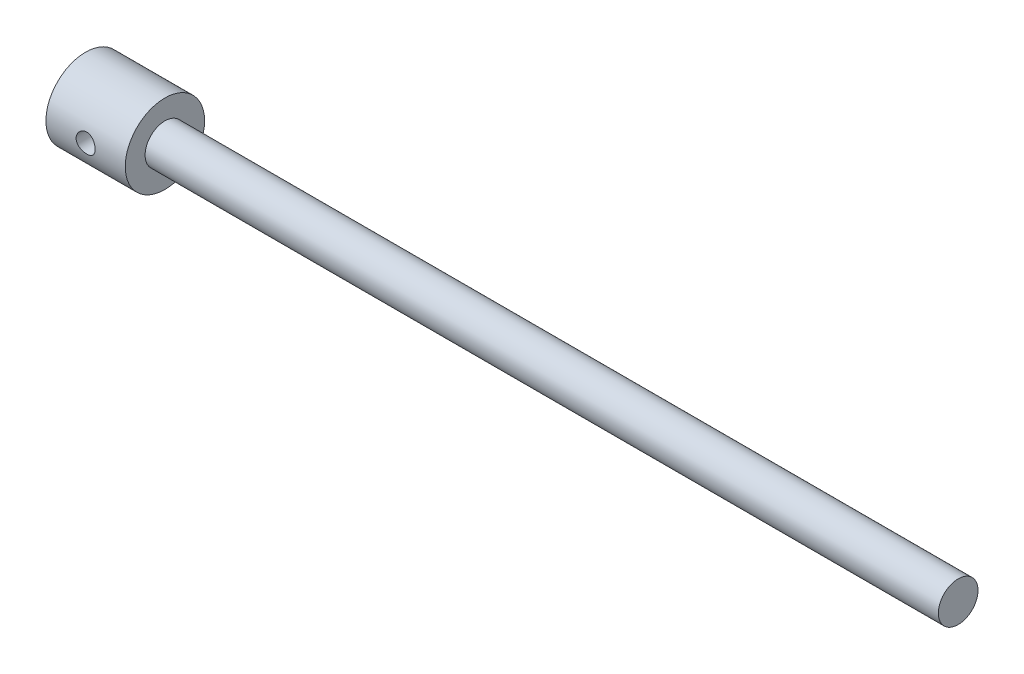
ISO-10303-21;
HEADER;
FILE_DESCRIPTION(('STEP AP214'),'2;1');
FILE_NAME('part.step','',(''),(''),'','','');
FILE_SCHEMA(('AUTOMOTIVE_DESIGN { 1 0 10303 214 1 1 1 1 }'));
ENDSEC;
DATA;
#1=APPLICATION_CONTEXT('core data for automotive mechanical design processes');
#2=APPLICATION_PROTOCOL_DEFINITION('international standard','automotive_design',2000,#1);
#3=PRODUCT_CONTEXT('',#1,'mechanical');
#4=PRODUCT('Part','Part','',(#3));
#5=PRODUCT_RELATED_PRODUCT_CATEGORY('part','',(#4));
#6=PRODUCT_DEFINITION_FORMATION('','',#4);
#7=PRODUCT_DEFINITION_CONTEXT('part definition',#1,'design');
#8=PRODUCT_DEFINITION('design','',#6,#7);
#9=PRODUCT_DEFINITION_SHAPE('','',#8);
#10=(LENGTH_UNIT() NAMED_UNIT(*) SI_UNIT(.MILLI.,.METRE.));
#11=(NAMED_UNIT(*) PLANE_ANGLE_UNIT() SI_UNIT($,.RADIAN.));
#12=(NAMED_UNIT(*) SI_UNIT($,.STERADIAN.) SOLID_ANGLE_UNIT());
#13=UNCERTAINTY_MEASURE_WITH_UNIT(LENGTH_MEASURE(1.E-05),#10,'distance_accuracy_value','');
#14=(GEOMETRIC_REPRESENTATION_CONTEXT(3) GLOBAL_UNCERTAINTY_ASSIGNED_CONTEXT((#13)) GLOBAL_UNIT_ASSIGNED_CONTEXT((#10,
#11,#12)) REPRESENTATION_CONTEXT('',''));
#15=CARTESIAN_POINT('',(0.,0.,0.));
#16=DIRECTION('',(0.,0.,1.));
#17=DIRECTION('',(1.,0.,0.));
#18=AXIS2_PLACEMENT_3D('',#15,#16,#17);
#19=CARTESIAN_POINT('',(50.,0.,0.));
#20=DIRECTION('',(-1.,0.,0.));
#21=DIRECTION('',(0.,0.,1.));
#22=AXIS2_PLACEMENT_3D('',#19,#20,#21);
#23=CYLINDRICAL_SURFACE('',#22,25.);
#24=CARTESIAN_POINT('',(31.,0.,25.));
#25=CARTESIAN_POINT('',(31.0000045654021,-0.166017736340745,25.0000026804997));
#26=CARTESIAN_POINT('',(30.9931083315099,-0.331984064130572,24.9983437383731));
#27=CARTESIAN_POINT('',(30.9655909900526,-0.662757375273786,24.9917601768854));
#28=CARTESIAN_POINT('',(30.9449681517169,-0.827564209779565,24.9868351457074));
#29=CARTESIAN_POINT('',(30.8901535848326,-1.15483168687375,24.9738504635424));
#30=CARTESIAN_POINT('',(30.855957043403,-1.31729147606247,24.9657897007271));
#31=CARTESIAN_POINT('',(30.7742619207701,-1.63872050759381,24.9467537443302));
#32=CARTESIAN_POINT('',(30.7267584397992,-1.79768844089951,24.9357774773038));
#33=CARTESIAN_POINT('',(30.6189154000372,-2.11072366381165,24.9112316091515));
#34=CARTESIAN_POINT('',(30.5585957367627,-2.26479812859839,24.897666030887));
#35=CARTESIAN_POINT('',(30.4255126504005,-2.56731972417304,24.8682925860487));
#36=CARTESIAN_POINT('',(30.3527446342751,-2.71576475309531,24.8524838922068));
#37=CARTESIAN_POINT('',(30.1953429094483,-3.00593509691774,24.8190587739081));
#38=CARTESIAN_POINT('',(30.1107137253609,-3.14766294672407,24.8014430394569));
#39=CARTESIAN_POINT('',(29.930128760191,-3.42359889441685,24.7648612187919));
#40=CARTESIAN_POINT('',(29.8341687278593,-3.55780414185136,24.7458946268123));
#41=CARTESIAN_POINT('',(29.6298945004368,-3.81996752921303,24.7067947855154));
#42=CARTESIAN_POINT('',(29.5214001376863,-3.94778319107672,24.6866473068088));
#43=CARTESIAN_POINT('',(29.2940876458784,-4.19391043753479,24.6460277155742));
#44=CARTESIAN_POINT('',(29.1752657022346,-4.31221847908384,24.6255554853983));
#45=CARTESIAN_POINT('',(28.9281491358483,-4.53846894982133,24.5848634527513));
#46=CARTESIAN_POINT('',(28.7998569991231,-4.64641408237687,24.5646435856504));
#47=CARTESIAN_POINT('',(28.5345631328875,-4.85128465634762,24.5250062264423));
#48=CARTESIAN_POINT('',(28.3975582064556,-4.94820601608992,24.5055890332168));
#49=CARTESIAN_POINT('',(28.1139109412451,-5.1315149308875,24.4678652790419));
#50=CARTESIAN_POINT('',(27.9671650785524,-5.21774615640803,24.4495768107614));
#51=CARTESIAN_POINT('',(27.6666458172853,-5.37754406139993,24.4149279468241));
#52=CARTESIAN_POINT('',(27.5128697930405,-5.45110595933349,24.3985682798489));
#53=CARTESIAN_POINT('',(27.1994677660297,-5.58492026214268,24.3682865029779));
#54=CARTESIAN_POINT('',(27.0398446450393,-5.64517912327471,24.354363211339));
#55=CARTESIAN_POINT('',(26.7158528745254,-5.75195806967358,24.3293636773731));
#56=CARTESIAN_POINT('',(26.5514825437586,-5.79847322039682,24.318288457803));
#57=CARTESIAN_POINT('',(26.0591991958386,-5.91523377010967,24.2902598679583));
#58=CARTESIAN_POINT('',(25.7258747491139,-5.96534620186162,24.2778811042379));
#59=CARTESIAN_POINT('',(25.2235243982438,-5.99819895021148,24.2697663322526));
#60=CARTESIAN_POINT('',(25.055614512631,-6.00209048242323,24.2688053008257));
#61=CARTESIAN_POINT('',(24.7200533387406,-5.99581246294926,24.2703574949624));
#62=CARTESIAN_POINT('',(24.5524020533586,-5.98564275494965,24.2728707591485));
#63=CARTESIAN_POINT('',(24.0592354379643,-5.93483975630032,24.285368999466));
#64=CARTESIAN_POINT('',(23.7356610926301,-5.87440247397773,24.3001939850224));
#65=CARTESIAN_POINT('',(23.1035551402389,-5.70184242669471,24.3412549446464));
#66=CARTESIAN_POINT('',(22.7950245310886,-5.58971623816142,24.3674916745551));
#67=CARTESIAN_POINT('',(22.1981876883057,-5.3158825349441,24.4286958367201));
#68=CARTESIAN_POINT('',(21.9100987536133,-5.15371899452584,24.4637429965247));
#69=CARTESIAN_POINT('',(21.3647873385141,-4.78473374953622,24.5385748778448));
#70=CARTESIAN_POINT('',(21.1075698769834,-4.57790479882186,24.5783603675971));
#71=CARTESIAN_POINT('',(20.6242138778088,-4.11902988641842,24.6594640880418));
#72=CARTESIAN_POINT('',(20.3990660746999,-3.86594129003371,24.7007951674045));
#73=CARTESIAN_POINT('',(19.9942302876759,-3.32511184695823,24.7793903091839));
#74=CARTESIAN_POINT('',(19.8145434865743,-3.03737009894219,24.8166542657671));
#75=CARTESIAN_POINT('',(19.5054056318309,-2.43405695507431,24.8830789940348));
#76=CARTESIAN_POINT('',(19.3761051057317,-2.11840557448716,24.9122154123614));
#77=CARTESIAN_POINT('',(19.1726698236987,-1.46899521159138,24.9589240940734));
#78=CARTESIAN_POINT('',(19.0985253649671,-1.13523942521409,24.9764983913503));
#79=CARTESIAN_POINT('',(19.0089958704804,-0.467574800827577,24.9978055089126));
#80=CARTESIAN_POINT('',(18.9922601968733,-0.133856966575298,25.0018564268946));
#81=CARTESIAN_POINT('',(19.0143335519038,0.531608768658087,24.9965614831509));
#82=CARTESIAN_POINT('',(19.053137996564,0.86335682994432,24.9872167270307));
#83=CARTESIAN_POINT('',(19.1840738854237,1.51084514007902,24.9563832816127));
#84=CARTESIAN_POINT('',(19.2754779523593,1.8267410839496,24.9350603275565));
#85=CARTESIAN_POINT('',(19.5081966502045,2.43870667494971,24.8826669936479));
#86=CARTESIAN_POINT('',(19.6495160816406,2.73477441187556,24.8515956762951));
#87=CARTESIAN_POINT('',(19.9807321749523,3.30412273668564,24.7823820658762));
#88=CARTESIAN_POINT('',(20.171397626969,3.57694246966835,24.7441307708391));
#89=CARTESIAN_POINT('',(20.5949176655097,4.08719914724014,24.6649871461435));
#90=CARTESIAN_POINT('',(20.8277789307352,4.32463047973872,24.6240943990595));
#91=CARTESIAN_POINT('',(21.3352671241418,4.76284500809666,24.5431489449983));
#92=CARTESIAN_POINT('',(21.6107154179113,4.96268414096836,24.5031358001301));
#93=CARTESIAN_POINT('',(22.1922356795911,5.31333575577366,24.4295058119813));
#94=CARTESIAN_POINT('',(22.4983062754937,5.46415043292342,24.395888682328));
#95=CARTESIAN_POINT('',(22.9725936839859,5.64963439053451,24.353347630646));
#96=CARTESIAN_POINT('',(23.1328069566145,5.70458710242878,24.3405033891164));
#97=CARTESIAN_POINT('',(23.4574820200321,5.80079732294279,24.3177552029261));
#98=CARTESIAN_POINT('',(23.6219421871433,5.84205998439171,24.3078501521252));
#99=CARTESIAN_POINT('',(23.9539179032293,5.91053741786634,24.2912903166139));
#100=CARTESIAN_POINT('',(24.1214335511052,5.93775173433046,24.2846356373073));
#101=CARTESIAN_POINT('',(24.4582664668551,5.97789965204539,24.2747841701866));
#102=CARTESIAN_POINT('',(24.6275836538608,5.99083389159895,24.2715872278157));
#103=CARTESIAN_POINT('',(24.9622487305118,6.00215499594078,24.2687899616173));
#104=CARTESIAN_POINT('',(25.1275832844736,6.00091722515411,24.2690968340135));
#105=CARTESIAN_POINT('',(25.4575435219348,5.98480872784869,24.2730742483489));
#106=CARTESIAN_POINT('',(25.6221692208079,5.969938298505,24.2767447169658));
#107=CARTESIAN_POINT('',(25.9495546015662,5.92668661056588,24.2873399112073));
#108=CARTESIAN_POINT('',(26.1123139864983,5.89830323162515,24.294265147542));
#109=CARTESIAN_POINT('',(26.4347302014815,5.82827196779404,24.3111608262961));
#110=CARTESIAN_POINT('',(26.5943881062501,5.78662876790753,24.3211301931022));
#111=CARTESIAN_POINT('',(26.9088075189712,5.69063662986335,24.3437686465433));
#112=CARTESIAN_POINT('',(27.0635886271826,5.63634876916799,24.3564247302984));
#113=CARTESIAN_POINT('',(27.3679533881392,5.51539707483436,24.3840980883562));
#114=CARTESIAN_POINT('',(27.5175388295994,5.44873755154826,24.3991145400161));
#115=CARTESIAN_POINT('',(27.8106621669156,5.30348427217981,24.4310987091682));
#116=CARTESIAN_POINT('',(27.9541973483356,5.22488523075193,24.4480672900111));
#117=CARTESIAN_POINT('',(28.2341911451689,5.05635243091257,24.4834782828489));
#118=CARTESIAN_POINT('',(28.3706520835145,4.96642242689347,24.5019202059306));
#119=CARTESIAN_POINT('',(28.6389503832923,4.77346921711414,24.5402505889388));
#120=CARTESIAN_POINT('',(28.7705923311298,4.67017903544833,24.5601634300573));
#121=CARTESIAN_POINT('',(29.02470841849,4.45304880482868,24.600458146359));
#122=CARTESIAN_POINT('',(29.1471856811229,4.33921237965749,24.6208398586377));
#123=CARTESIAN_POINT('',(29.3822931129819,4.10164015488732,24.661530300392));
#124=CARTESIAN_POINT('',(29.4949174263774,3.97789855094998,24.6818389796797));
#125=CARTESIAN_POINT('',(29.7094481047576,3.7214296777047,24.7218081005976));
#126=CARTESIAN_POINT('',(29.8113583669331,3.58870570477299,24.7414687761375));
#127=CARTESIAN_POINT('',(30.0054239224955,3.31280088827595,24.7799327781137));
#128=CARTESIAN_POINT('',(30.0973872483625,3.16948213881107,24.7987162302532));
#129=CARTESIAN_POINT('',(30.2688530722884,2.8754381763477,24.8345280560803));
#130=CARTESIAN_POINT('',(30.3483601559727,2.72471571591035,24.8515570748485));
#131=CARTESIAN_POINT('',(30.4943122871475,2.41692354679156,24.883375777664));
#132=CARTESIAN_POINT('',(30.5607634733439,2.25985686316148,24.8981665133663));
#133=CARTESIAN_POINT('',(30.6801042720391,1.94048744711082,24.9250921884147));
#134=CARTESIAN_POINT('',(30.7329960562763,1.77818555787967,24.9372275530119));
#135=CARTESIAN_POINT('',(30.8520251734541,1.35190448336008,24.9647957983314));
#136=CARTESIAN_POINT('',(30.9074241484908,1.08469226075993,24.9779181465939));
#137=CARTESIAN_POINT('',(30.9814066442059,0.544940331071899,24.9955177731159));
#138=CARTESIAN_POINT('',(30.9999925091139,0.272400964328514,24.9999956018512));
#139=CARTESIAN_POINT('',(31.,0.,25.));
#140=B_SPLINE_CURVE_WITH_KNOTS('',3,(#24,#25,#26,#27,#28,#29,#30,#31,#32,#33,#34,#35,#36,#37,
#38,#39,#40,#41,#42,#43,#44,#45,#46,#47,#48,#49,#50,#51,#52,#53,#54,#55,#56,#57,#58,#59,#60,#61,
#62,#63,#64,#65,#66,#67,#68,#69,#70,#71,#72,#73,#74,#75,#76,#77,#78,#79,#80,#81,#82,#83,#84,#85,
#86,#87,#88,#89,#90,#91,#92,#93,#94,#95,#96,#97,#98,#99,#100,#101,#102,#103,#104,#105,#106,#107,
#108,#109,#110,#111,#112,#113,#114,#115,#116,#117,#118,#119,#120,#121,#122,#123,#124,#125,#126,
#127,#128,#129,#130,#131,#132,#133,#134,#135,#136,#137,#138,#139),.UNSPECIFIED.,.T.,.F.,(4,2,2,
2,2,2,2,2,2,2,2,2,2,2,2,2,2,2,2,2,2,2,2,2,2,2,2,2,2,2,2,2,2,2,2,2,2,2,2,2,2,2,2,2,2,2,2,2,2,2,2,
2,2,2,2,2,2,4),(0.,0.497813360100955,0.995689500769748,1.49374233325073,1.99197879609469,
2.4894473877073,2.98709992652941,3.48456314269129,3.98221359994715,4.48820831908741,
4.99439073274951,5.50044073797177,6.00667750796929,6.51961190143619,7.03273945954076,
7.54561743540079,8.05867933189507,9.06463756237654,9.56800871792682,10.0713854693234,
11.0548629550302,12.0384055899336,13.0311908061742,14.0241372047509,15.0430966233895,
16.0620825507942,17.0840897493149,18.1059171185591,19.1035329919673,20.1010665323702,
21.085126203147,22.069280539993,23.0698021185097,24.0704821968969,25.0936623603892,
26.1167967016263,26.6258643414059,27.1347401541084,27.6436324676663,28.1525020334114,
28.6479253897995,29.1433379468293,29.6388282657176,30.1341437102249,30.6271145113295,
31.1199138801487,31.6129320389054,32.105787268885,32.6107272666003,33.1154944014541,
33.6205595212516,34.1254402854413,34.6387770201076,35.1519243293048,35.6648297831432,
36.1776530362049,36.9945144051894,37.8113237554193),.UNSPECIFIED.);
#141=CARTESIAN_POINT('',(31.,0.,25.));
#142=VERTEX_POINT('',#141);
#143=EDGE_CURVE('E37',#142,#142,#140,.T.);
#144=ORIENTED_EDGE('',*,*,#143,.T.);
#145=EDGE_LOOP('',(#144));
#146=FACE_BOUND('',#145,.T.);
#147=CARTESIAN_POINT('',(31.,0.,-25.));
#148=CARTESIAN_POINT('',(31.0000045654021,0.166017736340745,-25.0000026804997));
#149=CARTESIAN_POINT('',(30.9931083315099,0.331984064130571,-24.9983437383731));
#150=CARTESIAN_POINT('',(30.9655909900526,0.662757375273784,-24.9917601768854));
#151=CARTESIAN_POINT('',(30.9449681517169,0.827564209779563,-24.9868351457074));
#152=CARTESIAN_POINT('',(30.8901535848326,1.15483168687374,-24.9738504635424));
#153=CARTESIAN_POINT('',(30.855957043403,1.31729147606247,-24.9657897007271));
#154=CARTESIAN_POINT('',(30.7742619207701,1.63872050759381,-24.9467537443302));
#155=CARTESIAN_POINT('',(30.7267584397992,1.79768844089951,-24.9357774773038));
#156=CARTESIAN_POINT('',(30.6189154000372,2.11072366381165,-24.9112316091515));
#157=CARTESIAN_POINT('',(30.5585957367627,2.26479812859838,-24.897666030887));
#158=CARTESIAN_POINT('',(30.4255126504005,2.56731972417304,-24.8682925860487));
#159=CARTESIAN_POINT('',(30.3527446342751,2.7157647530953,-24.8524838922068));
#160=CARTESIAN_POINT('',(30.1953429094483,3.00593509691774,-24.8190587739081));
#161=CARTESIAN_POINT('',(30.1107137253609,3.14766294672406,-24.8014430394569));
#162=CARTESIAN_POINT('',(29.930128760191,3.42359889441685,-24.7648612187919));
#163=CARTESIAN_POINT('',(29.8341687278593,3.55780414185136,-24.7458946268123));
#164=CARTESIAN_POINT('',(29.6298945004368,3.81996752921303,-24.7067947855154));
#165=CARTESIAN_POINT('',(29.5214001376863,3.94778319107671,-24.6866473068088));
#166=CARTESIAN_POINT('',(29.2940876458784,4.19391043753479,-24.6460277155742));
#167=CARTESIAN_POINT('',(29.1752657022346,4.31221847908383,-24.6255554853983));
#168=CARTESIAN_POINT('',(28.9281491358483,4.53846894982133,-24.5848634527513));
#169=CARTESIAN_POINT('',(28.7998569991231,4.64641408237687,-24.5646435856504));
#170=CARTESIAN_POINT('',(28.5345631328875,4.85128465634761,-24.5250062264423));
#171=CARTESIAN_POINT('',(28.3975582064557,4.94820601608992,-24.5055890332168));
#172=CARTESIAN_POINT('',(28.1139109412451,5.1315149308875,-24.4678652790419));
#173=CARTESIAN_POINT('',(27.9671650785524,5.21774615640803,-24.4495768107614));
#174=CARTESIAN_POINT('',(27.6666458172853,5.37754406139993,-24.4149279468241));
#175=CARTESIAN_POINT('',(27.5128697930405,5.45110595933348,-24.3985682798489));
#176=CARTESIAN_POINT('',(27.1994677660297,5.58492026214267,-24.3682865029779));
#177=CARTESIAN_POINT('',(27.0398446450393,5.6451791232747,-24.354363211339));
#178=CARTESIAN_POINT('',(26.7158528745254,5.75195806967358,-24.3293636773731));
#179=CARTESIAN_POINT('',(26.5514825437586,5.79847322039682,-24.318288457803));
#180=CARTESIAN_POINT('',(26.0591991958386,5.91523377010967,-24.2902598679583));
#181=CARTESIAN_POINT('',(25.7258747491139,5.96534620186162,-24.2778811042379));
#182=CARTESIAN_POINT('',(25.2235243982438,5.99819895021148,-24.2697663322526));
#183=CARTESIAN_POINT('',(25.055614512631,6.00209048242323,-24.2688053008257));
#184=CARTESIAN_POINT('',(24.7200533387406,5.99581246294926,-24.2703574949623));
#185=CARTESIAN_POINT('',(24.5524020533586,5.98564275494965,-24.2728707591485));
#186=CARTESIAN_POINT('',(24.0592354379643,5.93483975630032,-24.285368999466));
#187=CARTESIAN_POINT('',(23.7356610926301,5.87440247397773,-24.3001939850224));
#188=CARTESIAN_POINT('',(23.1035551402389,5.70184242669471,-24.3412549446464));
#189=CARTESIAN_POINT('',(22.7950245310886,5.58971623816142,-24.3674916745551));
#190=CARTESIAN_POINT('',(22.1981876883057,5.3158825349441,-24.4286958367201));
#191=CARTESIAN_POINT('',(21.9100987536133,5.15371899452584,-24.4637429965247));
#192=CARTESIAN_POINT('',(21.3647873385141,4.78473374953622,-24.5385748778448));
#193=CARTESIAN_POINT('',(21.1075698769835,4.57790479882186,-24.5783603675971));
#194=CARTESIAN_POINT('',(20.6242138778088,4.11902988641842,-24.6594640880418));
#195=CARTESIAN_POINT('',(20.3990660746999,3.86594129003371,-24.7007951674045));
#196=CARTESIAN_POINT('',(19.9942302876759,3.32511184695823,-24.7793903091839));
#197=CARTESIAN_POINT('',(19.8145434865743,3.03737009894219,-24.8166542657671));
#198=CARTESIAN_POINT('',(19.5054056318309,2.43405695507431,-24.8830789940348));
#199=CARTESIAN_POINT('',(19.3761051057317,2.11840557448716,-24.9122154123614));
#200=CARTESIAN_POINT('',(19.1726698236987,1.46899521159138,-24.9589240940734));
#201=CARTESIAN_POINT('',(19.0985253649671,1.13523942521409,-24.9764983913503));
#202=CARTESIAN_POINT('',(19.0089958704804,0.467574800827576,-24.9978055089126));
#203=CARTESIAN_POINT('',(18.9922601968733,0.133856966575298,-25.0018564268946));
#204=CARTESIAN_POINT('',(19.0143335519038,-0.531608768658085,-24.9965614831509));
#205=CARTESIAN_POINT('',(19.053137996564,-0.863356829944317,-24.9872167270307));
#206=CARTESIAN_POINT('',(19.1840738854237,-1.51084514007902,-24.9563832816127));
#207=CARTESIAN_POINT('',(19.2754779523593,-1.8267410839496,-24.9350603275565));
#208=CARTESIAN_POINT('',(19.5081966502045,-2.4387066749497,-24.8826669936479));
#209=CARTESIAN_POINT('',(19.6495160816406,-2.73477441187555,-24.8515956762951));
#210=CARTESIAN_POINT('',(19.9807321749523,-3.30412273668564,-24.7823820658762));
#211=CARTESIAN_POINT('',(20.171397626969,-3.57694246966835,-24.7441307708391));
#212=CARTESIAN_POINT('',(20.5949176655097,-4.08719914724013,-24.6649871461435));
#213=CARTESIAN_POINT('',(20.8277789307352,-4.32463047973872,-24.6240943990595));
#214=CARTESIAN_POINT('',(21.3352671241417,-4.76284500809665,-24.5431489449983));
#215=CARTESIAN_POINT('',(21.6107154179113,-4.96268414096836,-24.5031358001301));
#216=CARTESIAN_POINT('',(22.1922356795911,-5.31333575577366,-24.4295058119813));
#217=CARTESIAN_POINT('',(22.4983062754937,-5.46415043292341,-24.395888682328));
#218=CARTESIAN_POINT('',(22.9725936839859,-5.64963439053451,-24.353347630646));
#219=CARTESIAN_POINT('',(23.1328069566145,-5.70458710242878,-24.3405033891164));
#220=CARTESIAN_POINT('',(23.4574820200321,-5.80079732294279,-24.3177552029261));
#221=CARTESIAN_POINT('',(23.6219421871433,-5.84205998439171,-24.3078501521252));
#222=CARTESIAN_POINT('',(23.9539179032293,-5.91053741786634,-24.2912903166139));
#223=CARTESIAN_POINT('',(24.1214335511052,-5.93775173433045,-24.2846356373073));
#224=CARTESIAN_POINT('',(24.4582664668551,-5.97789965204539,-24.2747841701866));
#225=CARTESIAN_POINT('',(24.6275836538608,-5.99083389159895,-24.2715872278157));
#226=CARTESIAN_POINT('',(24.9622487305118,-6.00215499594078,-24.2687899616173));
#227=CARTESIAN_POINT('',(25.1275832844736,-6.00091722515411,-24.2690968340135));
#228=CARTESIAN_POINT('',(25.4575435219348,-5.98480872784869,-24.2730742483489));
#229=CARTESIAN_POINT('',(25.6221692208079,-5.969938298505,-24.2767447169658));
#230=CARTESIAN_POINT('',(25.9495546015662,-5.92668661056588,-24.2873399112073));
#231=CARTESIAN_POINT('',(26.1123139864983,-5.89830323162515,-24.294265147542));
#232=CARTESIAN_POINT('',(26.4347302014815,-5.82827196779404,-24.3111608262961));
#233=CARTESIAN_POINT('',(26.59438810625,-5.78662876790753,-24.3211301931022));
#234=CARTESIAN_POINT('',(26.9088075189712,-5.69063662986335,-24.3437686465433));
#235=CARTESIAN_POINT('',(27.0635886271826,-5.63634876916799,-24.3564247302984));
#236=CARTESIAN_POINT('',(27.3679533881392,-5.51539707483437,-24.3840980883562));
#237=CARTESIAN_POINT('',(27.5175388295994,-5.44873755154826,-24.3991145400161));
#238=CARTESIAN_POINT('',(27.8106621669156,-5.30348427217981,-24.4310987091682));
#239=CARTESIAN_POINT('',(27.9541973483356,-5.22488523075194,-24.4480672900111));
#240=CARTESIAN_POINT('',(28.2341911451689,-5.05635243091258,-24.4834782828489));
#241=CARTESIAN_POINT('',(28.3706520835145,-4.96642242689347,-24.5019202059306));
#242=CARTESIAN_POINT('',(28.6389503832923,-4.77346921711415,-24.5402505889388));
#243=CARTESIAN_POINT('',(28.7705923311298,-4.67017903544834,-24.5601634300573));
#244=CARTESIAN_POINT('',(29.02470841849,-4.45304880482868,-24.600458146359));
#245=CARTESIAN_POINT('',(29.1471856811229,-4.33921237965749,-24.6208398586377));
#246=CARTESIAN_POINT('',(29.3822931129819,-4.10164015488732,-24.661530300392));
#247=CARTESIAN_POINT('',(29.4949174263774,-3.97789855094998,-24.6818389796797));
#248=CARTESIAN_POINT('',(29.7094481047576,-3.7214296777047,-24.7218081005976));
#249=CARTESIAN_POINT('',(29.8113583669331,-3.58870570477298,-24.7414687761375));
#250=CARTESIAN_POINT('',(30.0054239224955,-3.31280088827595,-24.7799327781137));
#251=CARTESIAN_POINT('',(30.0973872483625,-3.16948213881107,-24.7987162302532));
#252=CARTESIAN_POINT('',(30.2688530722884,-2.8754381763477,-24.8345280560803));
#253=CARTESIAN_POINT('',(30.3483601559727,-2.72471571591034,-24.8515570748485));
#254=CARTESIAN_POINT('',(30.4943122871475,-2.41692354679156,-24.883375777664));
#255=CARTESIAN_POINT('',(30.5607634733439,-2.25985686316148,-24.8981665133663));
#256=CARTESIAN_POINT('',(30.6801042720391,-1.94048744711081,-24.9250921884147));
#257=CARTESIAN_POINT('',(30.7329960562763,-1.77818555787967,-24.9372275530119));
#258=CARTESIAN_POINT('',(30.8520251734541,-1.35190448336008,-24.9647957983314));
#259=CARTESIAN_POINT('',(30.9074241484908,-1.08469226075993,-24.9779181465939));
#260=CARTESIAN_POINT('',(30.9814066442059,-0.544940331071898,-24.9955177731159));
#261=CARTESIAN_POINT('',(30.9999925091139,-0.272400964328513,-24.9999956018512));
#262=CARTESIAN_POINT('',(31.,0.,-25.));
#263=B_SPLINE_CURVE_WITH_KNOTS('',3,(#147,#148,#149,#150,#151,#152,#153,#154,#155,#156,#157,
#158,#159,#160,#161,#162,#163,#164,#165,#166,#167,#168,#169,#170,#171,#172,#173,#174,#175,#176,
#177,#178,#179,#180,#181,#182,#183,#184,#185,#186,#187,#188,#189,#190,#191,#192,#193,#194,#195,
#196,#197,#198,#199,#200,#201,#202,#203,#204,#205,#206,#207,#208,#209,#210,#211,#212,#213,#214,
#215,#216,#217,#218,#219,#220,#221,#222,#223,#224,#225,#226,#227,#228,#229,#230,#231,#232,#233,
#234,#235,#236,#237,#238,#239,#240,#241,#242,#243,#244,#245,#246,#247,#248,#249,#250,#251,#252,
#253,#254,#255,#256,#257,#258,#259,#260,#261,#262),.UNSPECIFIED.,.T.,.F.,(4,2,2,2,2,2,2,2,2,2,2,
2,2,2,2,2,2,2,2,2,2,2,2,2,2,2,2,2,2,2,2,2,2,2,2,2,2,2,2,2,2,2,2,2,2,2,2,2,2,2,2,2,2,2,2,2,2,4),
(0.,0.497813360100954,0.995689500769746,1.49374233325073,1.99197879609469,2.4894473877073,
2.98709992652941,3.48456314269129,3.98221359994714,4.48820831908741,4.99439073274951,
5.50044073797176,6.00667750796928,6.51961190143619,7.03273945954075,7.54561743540079,
8.05867933189507,9.06463756237654,9.56800871792682,10.0713854693234,11.0548629550302,
12.0384055899336,13.0311908061742,14.0241372047509,15.0430966233895,16.0620825507942,
17.0840897493149,18.1059171185591,19.1035329919673,20.1010665323702,21.085126203147,
22.069280539993,23.0698021185097,24.0704821968969,25.0936623603892,26.1167967016263,
26.6258643414059,27.1347401541084,27.6436324676663,28.1525020334114,28.6479253897995,
29.1433379468293,29.6388282657176,30.1341437102249,30.6271145113294,31.1199138801486,
31.6129320389053,32.105787268885,32.6107272666003,33.1154944014541,33.6205595212516,
34.1254402854413,34.6387770201076,35.1519243293048,35.6648297831432,36.1776530362049,
36.9945144051894,37.8113237554193),.UNSPECIFIED.);
#264=CARTESIAN_POINT('',(31.,0.,-25.));
#265=VERTEX_POINT('',#264);
#266=EDGE_CURVE('E55',#265,#265,#263,.T.);
#267=ORIENTED_EDGE('',*,*,#266,.T.);
#268=EDGE_LOOP('',(#267));
#269=FACE_BOUND('',#268,.T.);
#270=CARTESIAN_POINT('',(50.,0.,0.));
#271=DIRECTION('',(1.,0.,0.));
#272=DIRECTION('',(0.,0.,-1.));
#273=AXIS2_PLACEMENT_3D('',#270,#271,#272);
#274=CIRCLE('',#273,25.);
#275=CARTESIAN_POINT('',(50.,0.,-25.));
#276=VERTEX_POINT('',#275);
#277=EDGE_CURVE('E44',#276,#276,#274,.T.);
#278=ORIENTED_EDGE('',*,*,#277,.F.);
#279=EDGE_LOOP('',(#278));
#280=FACE_BOUND('',#279,.T.);
#281=CARTESIAN_POINT('',(0.,0.,0.));
#282=DIRECTION('',(1.,0.,0.));
#283=DIRECTION('',(0.,0.,-1.));
#284=AXIS2_PLACEMENT_3D('',#281,#282,#283);
#285=CIRCLE('',#284,25.);
#286=CARTESIAN_POINT('',(0.,0.,-25.));
#287=VERTEX_POINT('',#286);
#288=EDGE_CURVE('E49',#287,#287,#285,.T.);
#289=ORIENTED_EDGE('',*,*,#288,.T.);
#290=EDGE_LOOP('',(#289));
#291=FACE_BOUND('',#290,.T.);
#292=ADVANCED_FACE('F33',(#146,#269,#280,#291),#23,.T.);
#293=CARTESIAN_POINT('',(50.,0.,0.));
#294=DIRECTION('',(1.,0.,0.));
#295=DIRECTION('',(0.,0.,-1.));
#296=AXIS2_PLACEMENT_3D('',#293,#294,#295);
#297=PLANE('',#296);
#298=CARTESIAN_POINT('',(50.,0.,0.));
#299=DIRECTION('',(1.,0.,0.));
#300=DIRECTION('',(0.,0.,-1.));
#301=AXIS2_PLACEMENT_3D('',#298,#299,#300);
#302=CIRCLE('',#301,12.5);
#303=CARTESIAN_POINT('',(50.,0.,-12.5));
#304=VERTEX_POINT('',#303);
#305=EDGE_CURVE('E10',#304,#304,#302,.T.);
#306=ORIENTED_EDGE('',*,*,#305,.F.);
#307=EDGE_LOOP('',(#306));
#308=FACE_BOUND('',#307,.T.);
#309=ORIENTED_EDGE('',*,*,#277,.T.);
#310=EDGE_LOOP('',(#309));
#311=FACE_BOUND('',#310,.T.);
#312=ADVANCED_FACE('F68',(#308,#311),#297,.T.);
#313=CARTESIAN_POINT('',(0.,0.,0.));
#314=DIRECTION('',(1.,0.,0.));
#315=DIRECTION('',(0.,0.,-1.));
#316=AXIS2_PLACEMENT_3D('',#313,#314,#315);
#317=PLANE('',#316);
#318=ORIENTED_EDGE('',*,*,#288,.F.);
#319=EDGE_LOOP('',(#318));
#320=FACE_BOUND('',#319,.T.);
#321=ADVANCED_FACE('F65',(#320),#317,.F.);
#322=CARTESIAN_POINT('',(25.,0.,-45.));
#323=DIRECTION('',(0.,0.,1.));
#324=DIRECTION('',(1.,0.,0.));
#325=AXIS2_PLACEMENT_3D('',#322,#323,#324);
#326=CYLINDRICAL_SURFACE('',#325,6.);
#327=ORIENTED_EDGE('',*,*,#266,.F.);
#328=EDGE_LOOP('',(#327));
#329=FACE_BOUND('',#328,.T.);
#330=ORIENTED_EDGE('',*,*,#143,.F.);
#331=EDGE_LOOP('',(#330));
#332=FACE_BOUND('',#331,.T.);
#333=ADVANCED_FACE('F59',(#329,#332),#326,.F.);
#334=CARTESIAN_POINT('',(550.,0.,0.));
#335=DIRECTION('',(-1.,0.,0.));
#336=DIRECTION('',(0.,0.,1.));
#337=AXIS2_PLACEMENT_3D('',#334,#335,#336);
#338=CYLINDRICAL_SURFACE('',#337,12.5);
#339=CARTESIAN_POINT('',(550.,0.,0.));
#340=DIRECTION('',(1.,0.,0.));
#341=DIRECTION('',(0.,0.,-1.));
#342=AXIS2_PLACEMENT_3D('',#339,#340,#341);
#343=CIRCLE('',#342,12.5);
#344=CARTESIAN_POINT('',(550.,0.,-12.5));
#345=VERTEX_POINT('',#344);
#346=EDGE_CURVE('E52',#345,#345,#343,.T.);
#347=ORIENTED_EDGE('',*,*,#346,.F.);
#348=EDGE_LOOP('',(#347));
#349=FACE_BOUND('',#348,.T.);
#350=ORIENTED_EDGE('',*,*,#305,.T.);
#351=EDGE_LOOP('',(#350));
#352=FACE_BOUND('',#351,.T.);
#353=ADVANCED_FACE('F64',(#349,#352),#338,.T.);
#354=CARTESIAN_POINT('',(550.,0.,0.));
#355=DIRECTION('',(1.,0.,0.));
#356=DIRECTION('',(0.,0.,-1.));
#357=AXIS2_PLACEMENT_3D('',#354,#355,#356);
#358=PLANE('',#357);
#359=ORIENTED_EDGE('',*,*,#346,.T.);
#360=EDGE_LOOP('',(#359));
#361=FACE_BOUND('',#360,.T.);
#362=ADVANCED_FACE('F108',(#361),#358,.T.);
#363=CLOSED_SHELL('',(#292,#312,#321,#333,#353,#362));
#364=MANIFOLD_SOLID_BREP('B2',#363);
#365=ADVANCED_BREP_SHAPE_REPRESENTATION('',(#18,#364),#14);
#366=SHAPE_DEFINITION_REPRESENTATION(#9,#365);
ENDSEC;
END-ISO-10303-21;
